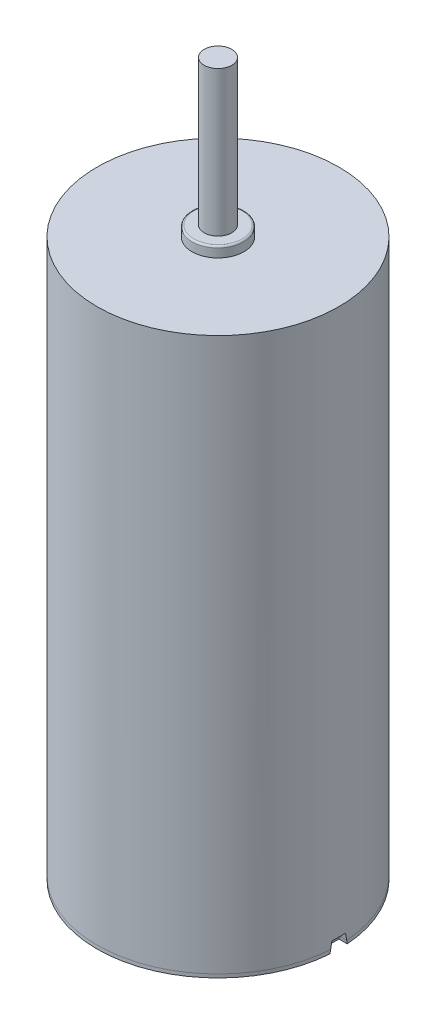
ISO-10303-21;
HEADER;
FILE_DESCRIPTION(('STEP AP214'),'2;1');
FILE_NAME('part.step','',(''),(''),'','','');
FILE_SCHEMA(('AUTOMOTIVE_DESIGN { 1 0 10303 214 1 1 1 1 }'));
ENDSEC;
DATA;
#1=APPLICATION_CONTEXT('core data for automotive mechanical design processes');
#2=APPLICATION_PROTOCOL_DEFINITION('international standard','automotive_design',2000,#1);
#3=PRODUCT_CONTEXT('',#1,'mechanical');
#4=PRODUCT('Part','Part','',(#3));
#5=PRODUCT_RELATED_PRODUCT_CATEGORY('part','',(#4));
#6=PRODUCT_DEFINITION_FORMATION('','',#4);
#7=PRODUCT_DEFINITION_CONTEXT('part definition',#1,'design');
#8=PRODUCT_DEFINITION('design','',#6,#7);
#9=PRODUCT_DEFINITION_SHAPE('','',#8);
#10=(LENGTH_UNIT() NAMED_UNIT(*) SI_UNIT(.MILLI.,.METRE.));
#11=(NAMED_UNIT(*) PLANE_ANGLE_UNIT() SI_UNIT($,.RADIAN.));
#12=(NAMED_UNIT(*) SI_UNIT($,.STERADIAN.) SOLID_ANGLE_UNIT());
#13=UNCERTAINTY_MEASURE_WITH_UNIT(LENGTH_MEASURE(1.E-05),#10,'distance_accuracy_value','');
#14=(GEOMETRIC_REPRESENTATION_CONTEXT(3) GLOBAL_UNCERTAINTY_ASSIGNED_CONTEXT((#13)) GLOBAL_UNIT_ASSIGNED_CONTEXT((#10,
#11,#12)) REPRESENTATION_CONTEXT('',''));
#15=CARTESIAN_POINT('',(0.,0.,0.));
#16=DIRECTION('',(0.,0.,1.));
#17=DIRECTION('',(1.,0.,0.));
#18=AXIS2_PLACEMENT_3D('',#15,#16,#17);
#19=CARTESIAN_POINT('',(0.,-0.1,0.));
#20=DIRECTION('',(0.,1.,0.));
#21=DIRECTION('',(0.,0.,1.));
#22=AXIS2_PLACEMENT_3D('',#19,#20,#21);
#23=CYLINDRICAL_SURFACE('',#22,3.5);
#24=CARTESIAN_POINT('',(0.,-0.1,0.));
#25=DIRECTION('',(0.,-1.,0.));
#26=DIRECTION('',(0.,0.,-1.));
#27=AXIS2_PLACEMENT_3D('',#24,#25,#26);
#28=CIRCLE('',#27,3.5);
#29=CARTESIAN_POINT('',(3.49106001094224,-0.1,0.25));
#30=VERTEX_POINT('',#29);
#31=CARTESIAN_POINT('',(-3.49106001094224,-0.1,0.250000000000002));
#32=VERTEX_POINT('',#31);
#33=EDGE_CURVE('E160',#30,#32,#28,.T.);
#34=ORIENTED_EDGE('',*,*,#33,.F.);
#35=CARTESIAN_POINT('',(0.,1.31782045490442,0.));
#36=DIRECTION('',(0.,0.173648177666931,0.984807753012208));
#37=DIRECTION('',(0.,0.984807753012208,-0.173648177666931));
#38=AXIS2_PLACEMENT_3D('',#35,#36,#37);
#39=ELLIPSE('',#38,20.1556966910027,3.5);
#40=CARTESIAN_POINT('',(3.49227797246928,0.,0.232367301929153));
#41=VERTEX_POINT('',#40);
#42=EDGE_CURVE('E155',#30,#41,#39,.T.);
#43=ORIENTED_EDGE('',*,*,#42,.T.);
#44=CARTESIAN_POINT('',(0.,0.,0.));
#45=DIRECTION('',(0.,-1.,0.));
#46=DIRECTION('',(0.,0.,-1.));
#47=AXIS2_PLACEMENT_3D('',#44,#45,#46);
#48=CIRCLE('',#47,3.5);
#49=CARTESIAN_POINT('',(-3.49227797246928,0.,0.232367301929155));
#50=VERTEX_POINT('',#49);
#51=EDGE_CURVE('E161',#41,#50,#48,.T.);
#52=ORIENTED_EDGE('',*,*,#51,.T.);
#53=CARTESIAN_POINT('',(0.,1.31782045490443,0.));
#54=DIRECTION('',(0.,0.173648177666931,0.984807753012208));
#55=DIRECTION('',(0.,0.984807753012208,-0.173648177666931));
#56=AXIS2_PLACEMENT_3D('',#53,#54,#55);
#57=ELLIPSE('',#56,20.1556966910027,3.5);
#58=EDGE_CURVE('E151',#50,#32,#57,.T.);
#59=ORIENTED_EDGE('',*,*,#58,.T.);
#60=EDGE_LOOP('',(#34,#43,#52,#59));
#61=FACE_BOUND('',#60,.T.);
#62=ADVANCED_FACE('F47',(#61),#23,.T.);
#63=CARTESIAN_POINT('',(-3.49227797246928,0.,-0.232367301929152));
#64=VERTEX_POINT('',#63);
#65=CARTESIAN_POINT('',(3.49227797246928,0.,-0.232367301929153));
#66=VERTEX_POINT('',#65);
#67=EDGE_CURVE('E158',#64,#66,#48,.T.);
#68=ORIENTED_EDGE('',*,*,#67,.T.);
#69=CARTESIAN_POINT('',(0.,1.31782045490443,0.));
#70=DIRECTION('',(0.,0.173648177666931,-0.984807753012208));
#71=DIRECTION('',(0.,0.984807753012208,0.173648177666931));
#72=AXIS2_PLACEMENT_3D('',#69,#70,#71);
#73=ELLIPSE('',#72,20.1556966910027,3.5);
#74=CARTESIAN_POINT('',(3.49106001094224,-0.1,-0.25));
#75=VERTEX_POINT('',#74);
#76=EDGE_CURVE('E70',#66,#75,#73,.T.);
#77=ORIENTED_EDGE('',*,*,#76,.T.);
#78=CARTESIAN_POINT('',(-3.49106001094224,-0.1,-0.249999999999998));
#79=VERTEX_POINT('',#78);
#80=EDGE_CURVE('E134',#79,#75,#28,.T.);
#81=ORIENTED_EDGE('',*,*,#80,.F.);
#82=CARTESIAN_POINT('',(0.,1.31782045490442,0.));
#83=DIRECTION('',(0.,0.173648177666931,-0.984807753012208));
#84=DIRECTION('',(0.,0.984807753012208,0.173648177666931));
#85=AXIS2_PLACEMENT_3D('',#82,#83,#84);
#86=ELLIPSE('',#85,20.1556966910027,3.5);
#87=EDGE_CURVE('E138',#79,#64,#86,.T.);
#88=ORIENTED_EDGE('',*,*,#87,.T.);
#89=EDGE_LOOP('',(#68,#77,#81,#88));
#90=FACE_BOUND('',#89,.T.);
#91=ADVANCED_FACE('F49',(#90),#23,.T.);
#92=CARTESIAN_POINT('',(0.,-0.1,0.));
#93=DIRECTION('',(0.,-1.,0.));
#94=DIRECTION('',(0.,0.,-1.));
#95=AXIS2_PLACEMENT_3D('',#92,#93,#94);
#96=PLANE('',#95);
#97=DIRECTION('',(-1.,0.,0.));
#98=VECTOR('',#97,1.);
#99=CARTESIAN_POINT('',(3.75,-0.1,0.25));
#100=LINE('',#99,#98);
#101=CARTESIAN_POINT('',(3.25,-0.1,0.25));
#102=VERTEX_POINT('',#101);
#103=EDGE_CURVE('E119',#30,#102,#100,.T.);
#104=ORIENTED_EDGE('',*,*,#103,.F.);
#105=ORIENTED_EDGE('',*,*,#33,.T.);
#106=DIRECTION('',(-1.,0.,0.));
#107=VECTOR('',#106,1.);
#108=CARTESIAN_POINT('',(-3.75,-0.1,0.250000000000002));
#109=LINE('',#108,#107);
#110=CARTESIAN_POINT('',(-3.25,-0.1,0.250000000000002));
#111=VERTEX_POINT('',#110);
#112=EDGE_CURVE('E140',#111,#32,#109,.T.);
#113=ORIENTED_EDGE('',*,*,#112,.F.);
#114=DIRECTION('',(0.,0.,1.));
#115=VECTOR('',#114,1.);
#116=CARTESIAN_POINT('',(-3.25,-0.1,0.250000000000002));
#117=LINE('',#116,#115);
#118=CARTESIAN_POINT('',(-3.25,-0.1,-0.249999999999998));
#119=VERTEX_POINT('',#118);
#120=EDGE_CURVE('E144',#119,#111,#117,.T.);
#121=ORIENTED_EDGE('',*,*,#120,.F.);
#122=DIRECTION('',(1.,0.,0.));
#123=VECTOR('',#122,1.);
#124=CARTESIAN_POINT('',(-3.75,-0.1,-0.249999999999998));
#125=LINE('',#124,#123);
#126=EDGE_CURVE('E142',#79,#119,#125,.T.);
#127=ORIENTED_EDGE('',*,*,#126,.F.);
#128=ORIENTED_EDGE('',*,*,#80,.T.);
#129=DIRECTION('',(1.,0.,0.));
#130=VECTOR('',#129,1.);
#131=CARTESIAN_POINT('',(3.75,-0.1,-0.25));
#132=LINE('',#131,#130);
#133=CARTESIAN_POINT('',(3.25,-0.1,-0.25));
#134=VERTEX_POINT('',#133);
#135=EDGE_CURVE('E114',#134,#75,#132,.T.);
#136=ORIENTED_EDGE('',*,*,#135,.F.);
#137=DIRECTION('',(0.,0.,-1.));
#138=VECTOR('',#137,1.);
#139=CARTESIAN_POINT('',(3.25,-0.1,0.25));
#140=LINE('',#139,#138);
#141=EDGE_CURVE('E122',#102,#134,#140,.T.);
#142=ORIENTED_EDGE('',*,*,#141,.F.);
#143=EDGE_LOOP('',(#104,#105,#113,#121,#127,#128,#136,#142));
#144=FACE_BOUND('',#143,.T.);
#145=ADVANCED_FACE('F131',(#144),#96,.T.);
#146=CARTESIAN_POINT('',(0.,0.,0.));
#147=DIRECTION('',(0.,-1.,0.));
#148=DIRECTION('',(0.,0.,-1.));
#149=AXIS2_PLACEMENT_3D('',#146,#147,#148);
#150=PLANE('',#149);
#151=ORIENTED_EDGE('',*,*,#51,.F.);
#152=DIRECTION('',(-1.,0.,0.));
#153=VECTOR('',#152,1.);
#154=CARTESIAN_POINT('',(0.,0.,0.232367301929153));
#155=LINE('',#154,#153);
#156=CARTESIAN_POINT('',(3.26763269807085,0.,0.232367301929153));
#157=VERTEX_POINT('',#156);
#158=EDGE_CURVE('E12',#41,#157,#155,.T.);
#159=ORIENTED_EDGE('',*,*,#158,.T.);
#160=DIRECTION('',(0.,0.,-1.));
#161=VECTOR('',#160,1.);
#162=CARTESIAN_POINT('',(3.26763269807085,0.,0.));
#163=LINE('',#162,#161);
#164=CARTESIAN_POINT('',(3.26763269807085,0.,-0.232367301929153));
#165=VERTEX_POINT('',#164);
#166=EDGE_CURVE('E55',#157,#165,#163,.T.);
#167=ORIENTED_EDGE('',*,*,#166,.T.);
#168=DIRECTION('',(1.,0.,0.));
#169=VECTOR('',#168,1.);
#170=CARTESIAN_POINT('',(0.,0.,-0.232367301929154));
#171=LINE('',#170,#169);
#172=EDGE_CURVE('E115',#165,#66,#171,.T.);
#173=ORIENTED_EDGE('',*,*,#172,.T.);
#174=ORIENTED_EDGE('',*,*,#67,.F.);
#175=DIRECTION('',(1.,0.,0.));
#176=VECTOR('',#175,1.);
#177=CARTESIAN_POINT('',(0.,0.,-0.232367301929152));
#178=LINE('',#177,#176);
#179=CARTESIAN_POINT('',(-3.26763269807085,0.,-0.232367301929152));
#180=VERTEX_POINT('',#179);
#181=EDGE_CURVE('E164',#64,#180,#178,.T.);
#182=ORIENTED_EDGE('',*,*,#181,.T.);
#183=DIRECTION('',(0.,0.,1.));
#184=VECTOR('',#183,1.);
#185=CARTESIAN_POINT('',(-3.26763269807085,0.,0.));
#186=LINE('',#185,#184);
#187=CARTESIAN_POINT('',(-3.26763269807085,0.,0.232367301929155));
#188=VERTEX_POINT('',#187);
#189=EDGE_CURVE('E167',#180,#188,#186,.T.);
#190=ORIENTED_EDGE('',*,*,#189,.T.);
#191=DIRECTION('',(-1.,0.,0.));
#192=VECTOR('',#191,1.);
#193=CARTESIAN_POINT('',(0.,0.,0.232367301929155));
#194=LINE('',#193,#192);
#195=EDGE_CURVE('E170',#188,#50,#194,.T.);
#196=ORIENTED_EDGE('',*,*,#195,.T.);
#197=EDGE_LOOP('',(#151,#159,#167,#173,#174,#182,#190,#196));
#198=FACE_BOUND('',#197,.T.);
#199=ADVANCED_FACE('F175',(#198),#150,.F.);
#200=CARTESIAN_POINT('',(-3.75,-0.1,0.250000000000002));
#201=DIRECTION('',(0.,0.173648177666931,0.984807753012208));
#202=DIRECTION('',(0.,-0.984807753012208,0.173648177666931));
#203=AXIS2_PLACEMENT_3D('',#200,#201,#202);
#204=PLANE('',#203);
#205=ORIENTED_EDGE('',*,*,#195,.F.);
#206=DIRECTION('',(0.171087869746036,-0.970287525247814,0.171087869746036));
#207=VECTOR('',#206,1.);
#208=CARTESIAN_POINT('',(-3.25,-0.1,0.250000000000002));
#209=LINE('',#208,#207);
#210=EDGE_CURVE('E128',#188,#111,#209,.T.);
#211=ORIENTED_EDGE('',*,*,#210,.T.);
#212=ORIENTED_EDGE('',*,*,#112,.T.);
#213=ORIENTED_EDGE('',*,*,#58,.F.);
#214=EDGE_LOOP('',(#205,#211,#212,#213));
#215=FACE_BOUND('',#214,.T.);
#216=ADVANCED_FACE('F185',(#215),#204,.F.);
#217=CARTESIAN_POINT('',(-3.25,-0.1,0.250000000000002));
#218=DIRECTION('',(0.984807753012208,0.173648177666931,0.));
#219=DIRECTION('',(-0.173648177666931,0.984807753012208,0.));
#220=AXIS2_PLACEMENT_3D('',#217,#218,#219);
#221=PLANE('',#220);
#222=DIRECTION('',(0.171087869746036,-0.970287525247814,-0.171087869746036));
#223=VECTOR('',#222,1.);
#224=CARTESIAN_POINT('',(-3.26463552958712,-0.0169977871320993,-0.23536447041288));
#225=LINE('',#224,#223);
#226=EDGE_CURVE('E62',#180,#119,#225,.T.);
#227=ORIENTED_EDGE('',*,*,#226,.T.);
#228=ORIENTED_EDGE('',*,*,#120,.T.);
#229=ORIENTED_EDGE('',*,*,#210,.F.);
#230=ORIENTED_EDGE('',*,*,#189,.F.);
#231=EDGE_LOOP('',(#227,#228,#229,#230));
#232=FACE_BOUND('',#231,.T.);
#233=ADVANCED_FACE('F188',(#232),#221,.F.);
#234=CARTESIAN_POINT('',(-3.75,-0.1,-0.249999999999998));
#235=DIRECTION('',(0.,0.173648177666931,-0.984807753012208));
#236=DIRECTION('',(0.,0.984807753012208,0.173648177666931));
#237=AXIS2_PLACEMENT_3D('',#234,#235,#236);
#238=PLANE('',#237);
#239=ORIENTED_EDGE('',*,*,#126,.T.);
#240=ORIENTED_EDGE('',*,*,#226,.F.);
#241=ORIENTED_EDGE('',*,*,#181,.F.);
#242=ORIENTED_EDGE('',*,*,#87,.F.);
#243=EDGE_LOOP('',(#239,#240,#241,#242));
#244=FACE_BOUND('',#243,.T.);
#245=ADVANCED_FACE('F191',(#244),#238,.F.);
#246=CARTESIAN_POINT('',(3.25,-0.1,0.25));
#247=DIRECTION('',(-0.984807753012208,0.173648177666931,0.));
#248=DIRECTION('',(-0.173648177666931,-0.984807753012208,0.));
#249=AXIS2_PLACEMENT_3D('',#246,#247,#248);
#250=PLANE('',#249);
#251=DIRECTION('',(-0.171087869746036,-0.970287525247814,0.171087869746036));
#252=VECTOR('',#251,1.);
#253=CARTESIAN_POINT('',(3.26463552958712,-0.0169977871320993,0.235364470412882));
#254=LINE('',#253,#252);
#255=EDGE_CURVE('E118',#157,#102,#254,.T.);
#256=ORIENTED_EDGE('',*,*,#255,.T.);
#257=ORIENTED_EDGE('',*,*,#141,.T.);
#258=DIRECTION('',(-0.171087869746036,-0.970287525247814,-0.171087869746036));
#259=VECTOR('',#258,1.);
#260=CARTESIAN_POINT('',(3.26463552958712,-0.0169977871320993,-0.235364470412882));
#261=LINE('',#260,#259);
#262=EDGE_CURVE('E110',#165,#134,#261,.T.);
#263=ORIENTED_EDGE('',*,*,#262,.F.);
#264=ORIENTED_EDGE('',*,*,#166,.F.);
#265=EDGE_LOOP('',(#256,#257,#263,#264));
#266=FACE_BOUND('',#265,.T.);
#267=ADVANCED_FACE('F123',(#266),#250,.F.);
#268=CARTESIAN_POINT('',(3.75,-0.1,0.25));
#269=DIRECTION('',(0.,0.173648177666931,0.984807753012208));
#270=DIRECTION('',(0.,-0.984807753012208,0.173648177666931));
#271=AXIS2_PLACEMENT_3D('',#268,#269,#270);
#272=PLANE('',#271);
#273=ORIENTED_EDGE('',*,*,#103,.T.);
#274=ORIENTED_EDGE('',*,*,#255,.F.);
#275=ORIENTED_EDGE('',*,*,#158,.F.);
#276=ORIENTED_EDGE('',*,*,#42,.F.);
#277=EDGE_LOOP('',(#273,#274,#275,#276));
#278=FACE_BOUND('',#277,.T.);
#279=ADVANCED_FACE('F178',(#278),#272,.F.);
#280=CARTESIAN_POINT('',(3.75,-0.1,-0.25));
#281=DIRECTION('',(0.,0.173648177666931,-0.984807753012208));
#282=DIRECTION('',(0.,0.984807753012208,0.173648177666931));
#283=AXIS2_PLACEMENT_3D('',#280,#281,#282);
#284=PLANE('',#283);
#285=ORIENTED_EDGE('',*,*,#172,.F.);
#286=ORIENTED_EDGE('',*,*,#262,.T.);
#287=ORIENTED_EDGE('',*,*,#135,.T.);
#288=ORIENTED_EDGE('',*,*,#76,.F.);
#289=EDGE_LOOP('',(#285,#286,#287,#288));
#290=FACE_BOUND('',#289,.T.);
#291=ADVANCED_FACE('F112',(#290),#284,.F.);
#292=CLOSED_SHELL('',(#62,#91,#145,#199,#216,#233,#245,#267,#279,#291));
#293=MANIFOLD_SOLID_BREP('B2',#292);
#294=CARTESIAN_POINT('',(0.,16.,0.));
#295=DIRECTION('',(0.,-1.,0.));
#296=DIRECTION('',(0.,0.,-1.));
#297=AXIS2_PLACEMENT_3D('',#294,#295,#296);
#298=CYLINDRICAL_SURFACE('',#297,3.5);
#299=CARTESIAN_POINT('',(0.,0.,0.));
#300=DIRECTION('',(0.,1.,0.));
#301=DIRECTION('',(0.,0.,1.));
#302=AXIS2_PLACEMENT_3D('',#299,#300,#301);
#303=CIRCLE('',#302,3.5);
#304=CARTESIAN_POINT('',(-3.49227797246928,0.,0.232367301929155));
#305=VERTEX_POINT('',#304);
#306=CARTESIAN_POINT('',(3.49227797246928,0.,0.232367301929153));
#307=VERTEX_POINT('',#306);
#308=EDGE_CURVE('E391',#305,#307,#303,.T.);
#309=ORIENTED_EDGE('',*,*,#308,.T.);
#310=CARTESIAN_POINT('',(0.,1.31782045490442,0.));
#311=DIRECTION('',(0.,0.173648177666931,0.984807753012208));
#312=DIRECTION('',(0.,-0.984807753012208,0.173648177666931));
#313=AXIS2_PLACEMENT_3D('',#310,#311,#312);
#314=ELLIPSE('',#313,20.1556966910027,3.5);
#315=CARTESIAN_POINT('',(3.49444571266102,0.199999999999999,0.19710190578746));
#316=VERTEX_POINT('',#315);
#317=EDGE_CURVE('E382',#307,#316,#314,.T.);
#318=ORIENTED_EDGE('',*,*,#317,.T.);
#319=CARTESIAN_POINT('',(0.,0.199999999999999,0.));
#320=DIRECTION('',(0.,1.,0.));
#321=DIRECTION('',(0.,0.,1.));
#322=AXIS2_PLACEMENT_3D('',#319,#320,#321);
#323=CIRCLE('',#322,3.5);
#324=CARTESIAN_POINT('',(3.49444571266102,0.199999999999999,-0.19710190578746));
#325=VERTEX_POINT('',#324);
#326=EDGE_CURVE('E45',#316,#325,#323,.T.);
#327=ORIENTED_EDGE('',*,*,#326,.T.);
#328=CARTESIAN_POINT('',(0.,1.31782045490443,0.));
#329=DIRECTION('',(0.,0.173648177666931,-0.984807753012208));
#330=DIRECTION('',(0.,-0.984807753012208,-0.173648177666931));
#331=AXIS2_PLACEMENT_3D('',#328,#329,#330);
#332=ELLIPSE('',#331,20.1556966910027,3.5);
#333=CARTESIAN_POINT('',(3.49227797246928,0.,-0.232367301929153));
#334=VERTEX_POINT('',#333);
#335=EDGE_CURVE('E379',#325,#334,#332,.T.);
#336=ORIENTED_EDGE('',*,*,#335,.T.);
#337=CARTESIAN_POINT('',(-3.49227797246928,0.,-0.232367301929152));
#338=VERTEX_POINT('',#337);
#339=EDGE_CURVE('E396',#334,#338,#303,.T.);
#340=ORIENTED_EDGE('',*,*,#339,.T.);
#341=CARTESIAN_POINT('',(0.,1.31782045490442,0.));
#342=DIRECTION('',(0.,0.173648177666931,-0.984807753012208));
#343=DIRECTION('',(0.,-0.984807753012208,-0.173648177666931));
#344=AXIS2_PLACEMENT_3D('',#341,#342,#343);
#345=ELLIPSE('',#344,20.1556966910027,3.5);
#346=CARTESIAN_POINT('',(-3.49444571266102,0.199999999999999,-0.197101905787459));
#347=VERTEX_POINT('',#346);
#348=EDGE_CURVE('E295',#338,#347,#345,.T.);
#349=ORIENTED_EDGE('',*,*,#348,.T.);
#350=CARTESIAN_POINT('',(0.,0.199999999999999,0.));
#351=DIRECTION('',(0.,1.,0.));
#352=DIRECTION('',(0.,0.,1.));
#353=AXIS2_PLACEMENT_3D('',#350,#351,#352);
#354=CIRCLE('',#353,3.5);
#355=CARTESIAN_POINT('',(-3.49444571266102,0.199999999999999,0.197101905787462));
#356=VERTEX_POINT('',#355);
#357=EDGE_CURVE('E280',#347,#356,#354,.T.);
#358=ORIENTED_EDGE('',*,*,#357,.T.);
#359=CARTESIAN_POINT('',(0.,1.31782045490443,0.));
#360=DIRECTION('',(0.,0.173648177666931,0.984807753012208));
#361=DIRECTION('',(0.,-0.984807753012208,0.173648177666931));
#362=AXIS2_PLACEMENT_3D('',#359,#360,#361);
#363=ELLIPSE('',#362,20.1556966910027,3.5);
#364=EDGE_CURVE('E376',#356,#305,#363,.T.);
#365=ORIENTED_EDGE('',*,*,#364,.T.);
#366=EDGE_LOOP('',(#309,#318,#327,#336,#340,#349,#358,#365));
#367=FACE_BOUND('',#366,.T.);
#368=CARTESIAN_POINT('',(0.,16.,0.));
#369=DIRECTION('',(0.,1.,0.));
#370=DIRECTION('',(0.,0.,1.));
#371=AXIS2_PLACEMENT_3D('',#368,#369,#370);
#372=CIRCLE('',#371,3.5);
#373=CARTESIAN_POINT('',(0.,16.,3.5));
#374=VERTEX_POINT('',#373);
#375=EDGE_CURVE('E392',#374,#374,#372,.T.);
#376=ORIENTED_EDGE('',*,*,#375,.F.);
#377=EDGE_LOOP('',(#376));
#378=FACE_BOUND('',#377,.T.);
#379=ADVANCED_FACE('F272',(#367,#378),#298,.T.);
#380=CARTESIAN_POINT('',(0.,16.,0.));
#381=DIRECTION('',(0.,1.,0.));
#382=DIRECTION('',(0.,0.,1.));
#383=AXIS2_PLACEMENT_3D('',#380,#381,#382);
#384=PLANE('',#383);
#385=CARTESIAN_POINT('',(0.,16.,0.));
#386=DIRECTION('',(0.,1.,0.));
#387=DIRECTION('',(0.,0.,1.));
#388=AXIS2_PLACEMENT_3D('',#385,#386,#387);
#389=CIRCLE('',#388,0.75);
#390=CARTESIAN_POINT('',(0.,16.,0.75));
#391=VERTEX_POINT('',#390);
#392=EDGE_CURVE('E384',#391,#391,#389,.T.);
#393=ORIENTED_EDGE('',*,*,#392,.F.);
#394=EDGE_LOOP('',(#393));
#395=FACE_BOUND('',#394,.T.);
#396=ORIENTED_EDGE('',*,*,#375,.T.);
#397=EDGE_LOOP('',(#396));
#398=FACE_BOUND('',#397,.T.);
#399=ADVANCED_FACE('F446',(#395,#398),#384,.T.);
#400=CARTESIAN_POINT('',(0.,0.,0.));
#401=DIRECTION('',(0.,1.,0.));
#402=DIRECTION('',(0.,0.,1.));
#403=AXIS2_PLACEMENT_3D('',#400,#401,#402);
#404=PLANE('',#403);
#405=DIRECTION('',(0.,0.,1.));
#406=VECTOR('',#405,1.);
#407=CARTESIAN_POINT('',(3.26763269807085,0.,0.));
#408=LINE('',#407,#406);
#409=CARTESIAN_POINT('',(3.26763269807085,0.,-0.232367301929153));
#410=VERTEX_POINT('',#409);
#411=CARTESIAN_POINT('',(3.26763269807085,0.,0.232367301929153));
#412=VERTEX_POINT('',#411);
#413=EDGE_CURVE('E417',#410,#412,#408,.T.);
#414=ORIENTED_EDGE('',*,*,#413,.T.);
#415=DIRECTION('',(1.,0.,0.));
#416=VECTOR('',#415,1.);
#417=CARTESIAN_POINT('',(0.,0.,0.232367301929153));
#418=LINE('',#417,#416);
#419=EDGE_CURVE('E352',#412,#307,#418,.T.);
#420=ORIENTED_EDGE('',*,*,#419,.T.);
#421=ORIENTED_EDGE('',*,*,#308,.F.);
#422=DIRECTION('',(1.,0.,0.));
#423=VECTOR('',#422,1.);
#424=CARTESIAN_POINT('',(0.,0.,0.232367301929155));
#425=LINE('',#424,#423);
#426=CARTESIAN_POINT('',(-3.26763269807085,0.,0.232367301929155));
#427=VERTEX_POINT('',#426);
#428=EDGE_CURVE('E411',#305,#427,#425,.T.);
#429=ORIENTED_EDGE('',*,*,#428,.T.);
#430=DIRECTION('',(0.,0.,-1.));
#431=VECTOR('',#430,1.);
#432=CARTESIAN_POINT('',(-3.26763269807085,0.,0.));
#433=LINE('',#432,#431);
#434=CARTESIAN_POINT('',(-3.26763269807085,0.,-0.232367301929152));
#435=VERTEX_POINT('',#434);
#436=EDGE_CURVE('E408',#427,#435,#433,.T.);
#437=ORIENTED_EDGE('',*,*,#436,.T.);
#438=DIRECTION('',(-1.,0.,0.));
#439=VECTOR('',#438,1.);
#440=CARTESIAN_POINT('',(0.,0.,-0.232367301929152));
#441=LINE('',#440,#439);
#442=EDGE_CURVE('E406',#435,#338,#441,.T.);
#443=ORIENTED_EDGE('',*,*,#442,.T.);
#444=ORIENTED_EDGE('',*,*,#339,.F.);
#445=DIRECTION('',(-1.,0.,0.));
#446=VECTOR('',#445,1.);
#447=CARTESIAN_POINT('',(0.,0.,-0.232367301929154));
#448=LINE('',#447,#446);
#449=EDGE_CURVE('E414',#334,#410,#448,.T.);
#450=ORIENTED_EDGE('',*,*,#449,.T.);
#451=EDGE_LOOP('',(#414,#420,#421,#429,#437,#443,#444,#450));
#452=FACE_BOUND('',#451,.T.);
#453=ADVANCED_FACE('F435',(#452),#404,.F.);
#454=CARTESIAN_POINT('',(0.,16.3,0.));
#455=DIRECTION('',(0.,-1.,0.));
#456=DIRECTION('',(0.,0.,-1.));
#457=AXIS2_PLACEMENT_3D('',#454,#455,#456);
#458=CYLINDRICAL_SURFACE('',#457,0.75);
#459=CARTESIAN_POINT('',(0.,16.25,0.));
#460=DIRECTION('',(0.,1.,0.));
#461=DIRECTION('',(0.,0.,1.));
#462=AXIS2_PLACEMENT_3D('',#459,#460,#461);
#463=CIRCLE('',#462,0.75);
#464=CARTESIAN_POINT('',(0.,16.25,0.75));
#465=VERTEX_POINT('',#464);
#466=EDGE_CURVE('E403',#465,#465,#463,.F.);
#467=ORIENTED_EDGE('',*,*,#466,.T.);
#468=EDGE_LOOP('',(#467));
#469=FACE_BOUND('',#468,.T.);
#470=ORIENTED_EDGE('',*,*,#392,.T.);
#471=EDGE_LOOP('',(#470));
#472=FACE_BOUND('',#471,.T.);
#473=ADVANCED_FACE('F454',(#469,#472),#458,.T.);
#474=CARTESIAN_POINT('',(0.,16.3,0.));
#475=DIRECTION('',(0.,1.,0.));
#476=DIRECTION('',(0.,0.,1.));
#477=AXIS2_PLACEMENT_3D('',#474,#475,#476);
#478=PLANE('',#477);
#479=CARTESIAN_POINT('',(0.,16.3,0.));
#480=DIRECTION('',(0.,1.,0.));
#481=DIRECTION('',(0.,0.,1.));
#482=AXIS2_PLACEMENT_3D('',#479,#480,#481);
#483=CIRCLE('',#482,0.7);
#484=CARTESIAN_POINT('',(0.,16.3,0.7));
#485=VERTEX_POINT('',#484);
#486=EDGE_CURVE('E395',#485,#485,#483,.T.);
#487=ORIENTED_EDGE('',*,*,#486,.T.);
#488=EDGE_LOOP('',(#487));
#489=FACE_BOUND('',#488,.T.);
#490=CARTESIAN_POINT('',(0.,16.3,0.));
#491=DIRECTION('',(0.,1.,0.));
#492=DIRECTION('',(0.,0.,1.));
#493=AXIS2_PLACEMENT_3D('',#490,#491,#492);
#494=CIRCLE('',#493,0.4);
#495=CARTESIAN_POINT('',(0.,16.3,0.4));
#496=VERTEX_POINT('',#495);
#497=EDGE_CURVE('E387',#496,#496,#494,.T.);
#498=ORIENTED_EDGE('',*,*,#497,.F.);
#499=EDGE_LOOP('',(#498));
#500=FACE_BOUND('',#499,.T.);
#501=ADVANCED_FACE('F463',(#489,#500),#478,.T.);
#502=CARTESIAN_POINT('',(0.,20.5,0.));
#503=DIRECTION('',(0.,1.,0.));
#504=DIRECTION('',(0.,0.,1.));
#505=AXIS2_PLACEMENT_3D('',#502,#503,#504);
#506=PLANE('',#505);
#507=CARTESIAN_POINT('',(0.,20.5,0.));
#508=DIRECTION('',(0.,1.,0.));
#509=DIRECTION('',(0.,0.,1.));
#510=AXIS2_PLACEMENT_3D('',#507,#508,#509);
#511=CIRCLE('',#510,0.4);
#512=CARTESIAN_POINT('',(0.,20.5,0.4));
#513=VERTEX_POINT('',#512);
#514=EDGE_CURVE('E388',#513,#513,#511,.T.);
#515=ORIENTED_EDGE('',*,*,#514,.T.);
#516=EDGE_LOOP('',(#515));
#517=FACE_BOUND('',#516,.T.);
#518=ADVANCED_FACE('F459',(#517),#506,.T.);
#519=CARTESIAN_POINT('',(0.,20.5,0.));
#520=DIRECTION('',(0.,-1.,0.));
#521=DIRECTION('',(0.,0.,-1.));
#522=AXIS2_PLACEMENT_3D('',#519,#520,#521);
#523=CYLINDRICAL_SURFACE('',#522,0.4);
#524=ORIENTED_EDGE('',*,*,#497,.T.);
#525=EDGE_LOOP('',(#524));
#526=FACE_BOUND('',#525,.T.);
#527=ORIENTED_EDGE('',*,*,#514,.F.);
#528=EDGE_LOOP('',(#527));
#529=FACE_BOUND('',#528,.T.);
#530=ADVANCED_FACE('F456',(#526,#529),#523,.T.);
#531=CARTESIAN_POINT('',(0.,16.25,0.));
#532=DIRECTION('',(0.,1.,0.));
#533=DIRECTION('',(0.,0.,1.));
#534=AXIS2_PLACEMENT_3D('',#531,#532,#533);
#535=TOROIDAL_SURFACE('',#534,0.7,0.05);
#536=ORIENTED_EDGE('',*,*,#466,.F.);
#537=EDGE_LOOP('',(#536));
#538=FACE_BOUND('',#537,.T.);
#539=ORIENTED_EDGE('',*,*,#486,.F.);
#540=EDGE_LOOP('',(#539));
#541=FACE_BOUND('',#540,.T.);
#542=ADVANCED_FACE('F274',(#538,#541),#535,.T.);
#543=CARTESIAN_POINT('',(0.,0.2,0.));
#544=DIRECTION('',(0.,1.,0.));
#545=DIRECTION('',(0.,0.,1.));
#546=AXIS2_PLACEMENT_3D('',#543,#544,#545);
#547=PLANE('',#546);
#548=DIRECTION('',(1.,0.,0.));
#549=VECTOR('',#548,1.);
#550=CARTESIAN_POINT('',(-3.75,0.2,-0.197101905787459));
#551=LINE('',#550,#549);
#552=CARTESIAN_POINT('',(-3.30289809421254,0.2,-0.197101905787459));
#553=VERTEX_POINT('',#552);
#554=EDGE_CURVE('E371',#347,#553,#551,.T.);
#555=ORIENTED_EDGE('',*,*,#554,.T.);
#556=DIRECTION('',(0.,0.,1.));
#557=VECTOR('',#556,1.);
#558=CARTESIAN_POINT('',(-3.30289809421254,0.2,0.250000000000002));
#559=LINE('',#558,#557);
#560=CARTESIAN_POINT('',(-3.30289809421254,0.2,0.197101905787462));
#561=VERTEX_POINT('',#560);
#562=EDGE_CURVE('E367',#553,#561,#559,.T.);
#563=ORIENTED_EDGE('',*,*,#562,.T.);
#564=DIRECTION('',(-1.,0.,0.));
#565=VECTOR('',#564,1.);
#566=CARTESIAN_POINT('',(-3.75,0.2,0.197101905787462));
#567=LINE('',#566,#565);
#568=EDGE_CURVE('E368',#561,#356,#567,.T.);
#569=ORIENTED_EDGE('',*,*,#568,.T.);
#570=ORIENTED_EDGE('',*,*,#357,.F.);
#571=EDGE_LOOP('',(#555,#563,#569,#570));
#572=FACE_BOUND('',#571,.T.);
#573=ADVANCED_FACE('F425',(#572),#547,.F.);
#574=CARTESIAN_POINT('',(-3.75,-0.1,0.250000000000002));
#575=DIRECTION('',(0.,0.173648177666931,0.984807753012208));
#576=DIRECTION('',(0.,-0.984807753012208,0.173648177666931));
#577=AXIS2_PLACEMENT_3D('',#574,#575,#576);
#578=PLANE('',#577);
#579=ORIENTED_EDGE('',*,*,#568,.F.);
#580=DIRECTION('',(0.171087869746036,-0.970287525247814,0.171087869746036));
#581=VECTOR('',#580,1.);
#582=CARTESIAN_POINT('',(-3.25,-0.1,0.250000000000002));
#583=LINE('',#582,#581);
#584=EDGE_CURVE('E357',#561,#427,#583,.T.);
#585=ORIENTED_EDGE('',*,*,#584,.T.);
#586=ORIENTED_EDGE('',*,*,#428,.F.);
#587=ORIENTED_EDGE('',*,*,#364,.F.);
#588=EDGE_LOOP('',(#579,#585,#586,#587));
#589=FACE_BOUND('',#588,.T.);
#590=ADVANCED_FACE('F433',(#589),#578,.F.);
#591=CARTESIAN_POINT('',(-3.25,-0.1,0.250000000000002));
#592=DIRECTION('',(0.984807753012208,0.173648177666931,0.));
#593=DIRECTION('',(-0.173648177666931,0.984807753012208,0.));
#594=AXIS2_PLACEMENT_3D('',#591,#592,#593);
#595=PLANE('',#594);
#596=ORIENTED_EDGE('',*,*,#584,.F.);
#597=ORIENTED_EDGE('',*,*,#562,.F.);
#598=DIRECTION('',(0.171087869746036,-0.970287525247814,-0.171087869746036));
#599=VECTOR('',#598,1.);
#600=CARTESIAN_POINT('',(-3.26463552958712,-0.0169977871320993,-0.23536447041288));
#601=LINE('',#600,#599);
#602=EDGE_CURVE('E361',#553,#435,#601,.T.);
#603=ORIENTED_EDGE('',*,*,#602,.T.);
#604=ORIENTED_EDGE('',*,*,#436,.F.);
#605=EDGE_LOOP('',(#596,#597,#603,#604));
#606=FACE_BOUND('',#605,.T.);
#607=ADVANCED_FACE('F431',(#606),#595,.F.);
#608=CARTESIAN_POINT('',(-3.75,-0.1,-0.249999999999998));
#609=DIRECTION('',(0.,0.173648177666931,-0.984807753012208));
#610=DIRECTION('',(0.,0.984807753012208,0.173648177666931));
#611=AXIS2_PLACEMENT_3D('',#608,#609,#610);
#612=PLANE('',#611);
#613=ORIENTED_EDGE('',*,*,#442,.F.);
#614=ORIENTED_EDGE('',*,*,#602,.F.);
#615=ORIENTED_EDGE('',*,*,#554,.F.);
#616=ORIENTED_EDGE('',*,*,#348,.F.);
#617=EDGE_LOOP('',(#613,#614,#615,#616));
#618=FACE_BOUND('',#617,.T.);
#619=ADVANCED_FACE('F428',(#618),#612,.F.);
#620=CARTESIAN_POINT('',(0.,0.2,0.));
#621=DIRECTION('',(0.,1.,0.));
#622=DIRECTION('',(0.,0.,1.));
#623=AXIS2_PLACEMENT_3D('',#620,#621,#622);
#624=PLANE('',#623);
#625=DIRECTION('',(-1.,0.,0.));
#626=VECTOR('',#625,1.);
#627=CARTESIAN_POINT('',(3.75,0.2,0.19710190578746));
#628=LINE('',#627,#626);
#629=CARTESIAN_POINT('',(3.30289809421254,0.2,0.19710190578746));
#630=VERTEX_POINT('',#629);
#631=EDGE_CURVE('E338',#316,#630,#628,.T.);
#632=ORIENTED_EDGE('',*,*,#631,.T.);
#633=DIRECTION('',(0.,0.,-1.));
#634=VECTOR('',#633,1.);
#635=CARTESIAN_POINT('',(3.30289809421254,0.2,0.25));
#636=LINE('',#635,#634);
#637=CARTESIAN_POINT('',(3.30289809421254,0.2,-0.19710190578746));
#638=VERTEX_POINT('',#637);
#639=EDGE_CURVE('E343',#630,#638,#636,.T.);
#640=ORIENTED_EDGE('',*,*,#639,.T.);
#641=DIRECTION('',(1.,0.,0.));
#642=VECTOR('',#641,1.);
#643=CARTESIAN_POINT('',(3.75,0.2,-0.19710190578746));
#644=LINE('',#643,#642);
#645=EDGE_CURVE('E346',#638,#325,#644,.T.);
#646=ORIENTED_EDGE('',*,*,#645,.T.);
#647=ORIENTED_EDGE('',*,*,#326,.F.);
#648=EDGE_LOOP('',(#632,#640,#646,#647));
#649=FACE_BOUND('',#648,.T.);
#650=ADVANCED_FACE('F340',(#649),#624,.F.);
#651=CARTESIAN_POINT('',(3.25,-0.1,0.25));
#652=DIRECTION('',(-0.984807753012208,0.173648177666931,0.));
#653=DIRECTION('',(-0.173648177666931,-0.984807753012208,0.));
#654=AXIS2_PLACEMENT_3D('',#651,#652,#653);
#655=PLANE('',#654);
#656=DIRECTION('',(-0.171087869746036,-0.970287525247814,-0.171087869746036));
#657=VECTOR('',#656,1.);
#658=CARTESIAN_POINT('',(3.26463552958712,-0.0169977871320993,-0.235364470412882));
#659=LINE('',#658,#657);
#660=EDGE_CURVE('E287',#638,#410,#659,.T.);
#661=ORIENTED_EDGE('',*,*,#660,.F.);
#662=ORIENTED_EDGE('',*,*,#639,.F.);
#663=DIRECTION('',(-0.171087869746036,-0.970287525247814,0.171087869746036));
#664=VECTOR('',#663,1.);
#665=CARTESIAN_POINT('',(3.26463552958712,-0.0169977871320993,0.235364470412882));
#666=LINE('',#665,#664);
#667=EDGE_CURVE('E349',#630,#412,#666,.T.);
#668=ORIENTED_EDGE('',*,*,#667,.T.);
#669=ORIENTED_EDGE('',*,*,#413,.F.);
#670=EDGE_LOOP('',(#661,#662,#668,#669));
#671=FACE_BOUND('',#670,.T.);
#672=ADVANCED_FACE('F356',(#671),#655,.F.);
#673=CARTESIAN_POINT('',(3.75,-0.1,0.25));
#674=DIRECTION('',(0.,0.173648177666931,0.984807753012208));
#675=DIRECTION('',(0.,-0.984807753012208,0.173648177666931));
#676=AXIS2_PLACEMENT_3D('',#673,#674,#675);
#677=PLANE('',#676);
#678=ORIENTED_EDGE('',*,*,#419,.F.);
#679=ORIENTED_EDGE('',*,*,#667,.F.);
#680=ORIENTED_EDGE('',*,*,#631,.F.);
#681=ORIENTED_EDGE('',*,*,#317,.F.);
#682=EDGE_LOOP('',(#678,#679,#680,#681));
#683=FACE_BOUND('',#682,.T.);
#684=ADVANCED_FACE('F350',(#683),#677,.F.);
#685=CARTESIAN_POINT('',(3.75,-0.1,-0.25));
#686=DIRECTION('',(0.,0.173648177666931,-0.984807753012208));
#687=DIRECTION('',(0.,0.984807753012208,0.173648177666931));
#688=AXIS2_PLACEMENT_3D('',#685,#686,#687);
#689=PLANE('',#688);
#690=ORIENTED_EDGE('',*,*,#645,.F.);
#691=ORIENTED_EDGE('',*,*,#660,.T.);
#692=ORIENTED_EDGE('',*,*,#449,.F.);
#693=ORIENTED_EDGE('',*,*,#335,.F.);
#694=EDGE_LOOP('',(#690,#691,#692,#693));
#695=FACE_BOUND('',#694,.T.);
#696=ADVANCED_FACE('F437',(#695),#689,.F.);
#697=CLOSED_SHELL('',(#379,#399,#453,#473,#501,#518,#530,#542,#573,#590,#607,#619,#650,#672,
#684,#696));
#698=MANIFOLD_SOLID_BREP('B6',#697);
#699=ADVANCED_BREP_SHAPE_REPRESENTATION('',(#18,#293,#698),#14);
#700=SHAPE_DEFINITION_REPRESENTATION(#9,#699);
ENDSEC;
END-ISO-10303-21;
